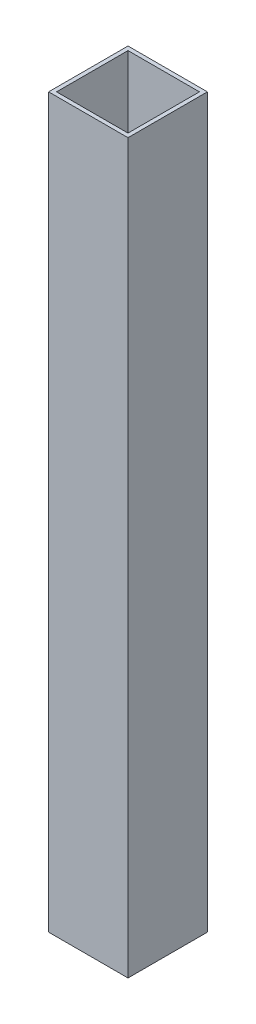
ISO-10303-21;
HEADER;
FILE_DESCRIPTION(('STEP AP214'),'2;1');
FILE_NAME('part.step','',(''),(''),'','','');
FILE_SCHEMA(('AUTOMOTIVE_DESIGN { 1 0 10303 214 1 1 1 1 }'));
ENDSEC;
DATA;
#1=APPLICATION_CONTEXT('core data for automotive mechanical design processes');
#2=APPLICATION_PROTOCOL_DEFINITION('international standard','automotive_design',2000,#1);
#3=PRODUCT_CONTEXT('',#1,'mechanical');
#4=PRODUCT('Part','Part','',(#3));
#5=PRODUCT_RELATED_PRODUCT_CATEGORY('part','',(#4));
#6=PRODUCT_DEFINITION_FORMATION('','',#4);
#7=PRODUCT_DEFINITION_CONTEXT('part definition',#1,'design');
#8=PRODUCT_DEFINITION('design','',#6,#7);
#9=PRODUCT_DEFINITION_SHAPE('','',#8);
#10=(LENGTH_UNIT() NAMED_UNIT(*) SI_UNIT(.MILLI.,.METRE.));
#11=(NAMED_UNIT(*) PLANE_ANGLE_UNIT() SI_UNIT($,.RADIAN.));
#12=(NAMED_UNIT(*) SI_UNIT($,.STERADIAN.) SOLID_ANGLE_UNIT());
#13=UNCERTAINTY_MEASURE_WITH_UNIT(LENGTH_MEASURE(1.E-05),#10,'distance_accuracy_value','');
#14=(GEOMETRIC_REPRESENTATION_CONTEXT(3) GLOBAL_UNCERTAINTY_ASSIGNED_CONTEXT((#13)) GLOBAL_UNIT_ASSIGNED_CONTEXT((#10,
#11,#12)) REPRESENTATION_CONTEXT('',''));
#15=CARTESIAN_POINT('',(0.,0.,0.));
#16=DIRECTION('',(0.,0.,1.));
#17=DIRECTION('',(1.,0.,0.));
#18=AXIS2_PLACEMENT_3D('',#15,#16,#17);
#19=CARTESIAN_POINT('',(0.,275.,0.));
#20=DIRECTION('',(0.,1.,0.));
#21=DIRECTION('',(0.,0.,1.));
#22=AXIS2_PLACEMENT_3D('',#19,#20,#21);
#23=PLANE('',#22);
#24=DIRECTION('',(0.,0.,1.));
#25=VECTOR('',#24,1.);
#26=CARTESIAN_POINT('',(0.,275.,0.));
#27=LINE('',#26,#25);
#28=CARTESIAN_POINT('',(0.,275.,0.));
#29=VERTEX_POINT('',#28);
#30=CARTESIAN_POINT('',(0.,275.,30.));
#31=VERTEX_POINT('',#30);
#32=EDGE_CURVE('E142',#29,#31,#27,.T.);
#33=ORIENTED_EDGE('',*,*,#32,.T.);
#34=DIRECTION('',(1.,0.,0.));
#35=VECTOR('',#34,1.);
#36=CARTESIAN_POINT('',(0.,275.,30.));
#37=LINE('',#36,#35);
#38=CARTESIAN_POINT('',(30.,275.,30.));
#39=VERTEX_POINT('',#38);
#40=EDGE_CURVE('E145',#31,#39,#37,.T.);
#41=ORIENTED_EDGE('',*,*,#40,.T.);
#42=DIRECTION('',(0.,0.,-1.));
#43=VECTOR('',#42,1.);
#44=CARTESIAN_POINT('',(30.,275.,0.));
#45=LINE('',#44,#43);
#46=CARTESIAN_POINT('',(30.,275.,0.));
#47=VERTEX_POINT('',#46);
#48=EDGE_CURVE('E148',#39,#47,#45,.T.);
#49=ORIENTED_EDGE('',*,*,#48,.T.);
#50=DIRECTION('',(-1.,0.,0.));
#51=VECTOR('',#50,1.);
#52=CARTESIAN_POINT('',(0.,275.,0.));
#53=LINE('',#52,#51);
#54=EDGE_CURVE('E150',#47,#29,#53,.T.);
#55=ORIENTED_EDGE('',*,*,#54,.T.);
#56=EDGE_LOOP('',(#33,#41,#49,#55));
#57=FACE_BOUND('',#56,.T.);
#58=DIRECTION('',(1.,0.,0.));
#59=VECTOR('',#58,1.);
#60=CARTESIAN_POINT('',(1.5,275.,28.5));
#61=LINE('',#60,#59);
#62=CARTESIAN_POINT('',(1.5,275.,28.5));
#63=VERTEX_POINT('',#62);
#64=CARTESIAN_POINT('',(28.5,275.,28.5));
#65=VERTEX_POINT('',#64);
#66=EDGE_CURVE('E114',#63,#65,#61,.T.);
#67=ORIENTED_EDGE('',*,*,#66,.F.);
#68=DIRECTION('',(0.,0.,1.));
#69=VECTOR('',#68,1.);
#70=CARTESIAN_POINT('',(1.5,275.,1.5));
#71=LINE('',#70,#69);
#72=CARTESIAN_POINT('',(1.5,275.,1.5));
#73=VERTEX_POINT('',#72);
#74=EDGE_CURVE('E106',#73,#63,#71,.T.);
#75=ORIENTED_EDGE('',*,*,#74,.F.);
#76=DIRECTION('',(-1.,0.,0.));
#77=VECTOR('',#76,1.);
#78=CARTESIAN_POINT('',(1.5,275.,1.5));
#79=LINE('',#78,#77);
#80=CARTESIAN_POINT('',(28.5,275.,1.5));
#81=VERTEX_POINT('',#80);
#82=EDGE_CURVE('E128',#81,#73,#79,.T.);
#83=ORIENTED_EDGE('',*,*,#82,.F.);
#84=DIRECTION('',(0.,0.,-1.));
#85=VECTOR('',#84,1.);
#86=CARTESIAN_POINT('',(28.5,275.,1.5));
#87=LINE('',#86,#85);
#88=EDGE_CURVE('E126',#65,#81,#87,.T.);
#89=ORIENTED_EDGE('',*,*,#88,.F.);
#90=EDGE_LOOP('',(#67,#75,#83,#89));
#91=FACE_BOUND('',#90,.T.);
#92=ADVANCED_FACE('F41',(#57,#91),#23,.T.);
#93=CARTESIAN_POINT('',(0.,0.,0.));
#94=DIRECTION('',(0.,1.,0.));
#95=DIRECTION('',(0.,0.,1.));
#96=AXIS2_PLACEMENT_3D('',#93,#94,#95);
#97=PLANE('',#96);
#98=DIRECTION('',(0.,0.,1.));
#99=VECTOR('',#98,1.);
#100=CARTESIAN_POINT('',(0.,0.,0.));
#101=LINE('',#100,#99);
#102=CARTESIAN_POINT('',(0.,0.,0.));
#103=VERTEX_POINT('',#102);
#104=CARTESIAN_POINT('',(0.,0.,30.));
#105=VERTEX_POINT('',#104);
#106=EDGE_CURVE('E122',#103,#105,#101,.T.);
#107=ORIENTED_EDGE('',*,*,#106,.F.);
#108=DIRECTION('',(-1.,0.,0.));
#109=VECTOR('',#108,1.);
#110=CARTESIAN_POINT('',(0.,0.,0.));
#111=LINE('',#110,#109);
#112=CARTESIAN_POINT('',(30.,0.,0.));
#113=VERTEX_POINT('',#112);
#114=EDGE_CURVE('E146',#113,#103,#111,.T.);
#115=ORIENTED_EDGE('',*,*,#114,.F.);
#116=DIRECTION('',(0.,0.,-1.));
#117=VECTOR('',#116,1.);
#118=CARTESIAN_POINT('',(30.,0.,0.));
#119=LINE('',#118,#117);
#120=CARTESIAN_POINT('',(30.,0.,30.));
#121=VERTEX_POINT('',#120);
#122=EDGE_CURVE('E157',#121,#113,#119,.T.);
#123=ORIENTED_EDGE('',*,*,#122,.F.);
#124=DIRECTION('',(1.,0.,0.));
#125=VECTOR('',#124,1.);
#126=CARTESIAN_POINT('',(0.,0.,30.));
#127=LINE('',#126,#125);
#128=EDGE_CURVE('E155',#105,#121,#127,.T.);
#129=ORIENTED_EDGE('',*,*,#128,.F.);
#130=EDGE_LOOP('',(#107,#115,#123,#129));
#131=FACE_BOUND('',#130,.T.);
#132=DIRECTION('',(0.,0.,1.));
#133=VECTOR('',#132,1.);
#134=CARTESIAN_POINT('',(1.5,0.,1.5));
#135=LINE('',#134,#133);
#136=CARTESIAN_POINT('',(1.5,0.,1.5));
#137=VERTEX_POINT('',#136);
#138=CARTESIAN_POINT('',(1.5,0.,28.5));
#139=VERTEX_POINT('',#138);
#140=EDGE_CURVE('E64',#137,#139,#135,.T.);
#141=ORIENTED_EDGE('',*,*,#140,.T.);
#142=DIRECTION('',(1.,0.,0.));
#143=VECTOR('',#142,1.);
#144=CARTESIAN_POINT('',(1.5,0.,28.5));
#145=LINE('',#144,#143);
#146=CARTESIAN_POINT('',(28.5,0.,28.5));
#147=VERTEX_POINT('',#146);
#148=EDGE_CURVE('E121',#139,#147,#145,.T.);
#149=ORIENTED_EDGE('',*,*,#148,.T.);
#150=DIRECTION('',(0.,0.,-1.));
#151=VECTOR('',#150,1.);
#152=CARTESIAN_POINT('',(28.5,0.,1.5));
#153=LINE('',#152,#151);
#154=CARTESIAN_POINT('',(28.5,0.,1.5));
#155=VERTEX_POINT('',#154);
#156=EDGE_CURVE('E134',#147,#155,#153,.T.);
#157=ORIENTED_EDGE('',*,*,#156,.T.);
#158=DIRECTION('',(-1.,0.,0.));
#159=VECTOR('',#158,1.);
#160=CARTESIAN_POINT('',(1.5,0.,1.5));
#161=LINE('',#160,#159);
#162=EDGE_CURVE('E115',#155,#137,#161,.T.);
#163=ORIENTED_EDGE('',*,*,#162,.T.);
#164=EDGE_LOOP('',(#141,#149,#157,#163));
#165=FACE_BOUND('',#164,.T.);
#166=ADVANCED_FACE('F175',(#131,#165),#97,.F.);
#167=CARTESIAN_POINT('',(0.,275.,0.));
#168=DIRECTION('',(1.,0.,0.));
#169=DIRECTION('',(0.,0.,-1.));
#170=AXIS2_PLACEMENT_3D('',#167,#168,#169);
#171=PLANE('',#170);
#172=ORIENTED_EDGE('',*,*,#106,.T.);
#173=DIRECTION('',(0.,-1.,0.));
#174=VECTOR('',#173,1.);
#175=CARTESIAN_POINT('',(0.,275.,30.));
#176=LINE('',#175,#174);
#177=EDGE_CURVE('E11',#31,#105,#176,.T.);
#178=ORIENTED_EDGE('',*,*,#177,.F.);
#179=ORIENTED_EDGE('',*,*,#32,.F.);
#180=DIRECTION('',(0.,-1.,0.));
#181=VECTOR('',#180,1.);
#182=CARTESIAN_POINT('',(0.,275.,0.));
#183=LINE('',#182,#181);
#184=EDGE_CURVE('E152',#29,#103,#183,.T.);
#185=ORIENTED_EDGE('',*,*,#184,.T.);
#186=EDGE_LOOP('',(#172,#178,#179,#185));
#187=FACE_BOUND('',#186,.T.);
#188=ADVANCED_FACE('F43',(#187),#171,.F.);
#189=CARTESIAN_POINT('',(0.,275.,30.));
#190=DIRECTION('',(0.,0.,-1.));
#191=DIRECTION('',(-1.,0.,0.));
#192=AXIS2_PLACEMENT_3D('',#189,#190,#191);
#193=PLANE('',#192);
#194=ORIENTED_EDGE('',*,*,#128,.T.);
#195=DIRECTION('',(0.,-1.,0.));
#196=VECTOR('',#195,1.);
#197=CARTESIAN_POINT('',(30.,275.,30.));
#198=LINE('',#197,#196);
#199=EDGE_CURVE('E49',#39,#121,#198,.T.);
#200=ORIENTED_EDGE('',*,*,#199,.F.);
#201=ORIENTED_EDGE('',*,*,#40,.F.);
#202=ORIENTED_EDGE('',*,*,#177,.T.);
#203=EDGE_LOOP('',(#194,#200,#201,#202));
#204=FACE_BOUND('',#203,.T.);
#205=ADVANCED_FACE('F185',(#204),#193,.F.);
#206=CARTESIAN_POINT('',(30.,275.,0.));
#207=DIRECTION('',(-1.,0.,0.));
#208=DIRECTION('',(0.,0.,1.));
#209=AXIS2_PLACEMENT_3D('',#206,#207,#208);
#210=PLANE('',#209);
#211=ORIENTED_EDGE('',*,*,#122,.T.);
#212=DIRECTION('',(0.,-1.,0.));
#213=VECTOR('',#212,1.);
#214=CARTESIAN_POINT('',(30.,275.,0.));
#215=LINE('',#214,#213);
#216=EDGE_CURVE('E162',#47,#113,#215,.T.);
#217=ORIENTED_EDGE('',*,*,#216,.F.);
#218=ORIENTED_EDGE('',*,*,#48,.F.);
#219=ORIENTED_EDGE('',*,*,#199,.T.);
#220=EDGE_LOOP('',(#211,#217,#218,#219));
#221=FACE_BOUND('',#220,.T.);
#222=ADVANCED_FACE('F169',(#221),#210,.F.);
#223=CARTESIAN_POINT('',(0.,275.,0.));
#224=DIRECTION('',(0.,0.,1.));
#225=DIRECTION('',(1.,0.,0.));
#226=AXIS2_PLACEMENT_3D('',#223,#224,#225);
#227=PLANE('',#226);
#228=ORIENTED_EDGE('',*,*,#114,.T.);
#229=ORIENTED_EDGE('',*,*,#184,.F.);
#230=ORIENTED_EDGE('',*,*,#54,.F.);
#231=ORIENTED_EDGE('',*,*,#216,.T.);
#232=EDGE_LOOP('',(#228,#229,#230,#231));
#233=FACE_BOUND('',#232,.T.);
#234=ADVANCED_FACE('F179',(#233),#227,.F.);
#235=CARTESIAN_POINT('',(1.5,275.,1.5));
#236=DIRECTION('',(1.,0.,0.));
#237=DIRECTION('',(0.,0.,-1.));
#238=AXIS2_PLACEMENT_3D('',#235,#236,#237);
#239=PLANE('',#238);
#240=ORIENTED_EDGE('',*,*,#140,.F.);
#241=DIRECTION('',(0.,-1.,0.));
#242=VECTOR('',#241,1.);
#243=CARTESIAN_POINT('',(1.5,275.,1.5));
#244=LINE('',#243,#242);
#245=EDGE_CURVE('E110',#73,#137,#244,.T.);
#246=ORIENTED_EDGE('',*,*,#245,.F.);
#247=ORIENTED_EDGE('',*,*,#74,.T.);
#248=DIRECTION('',(0.,-1.,0.));
#249=VECTOR('',#248,1.);
#250=CARTESIAN_POINT('',(1.5,275.,28.5));
#251=LINE('',#250,#249);
#252=EDGE_CURVE('E109',#63,#139,#251,.T.);
#253=ORIENTED_EDGE('',*,*,#252,.T.);
#254=EDGE_LOOP('',(#240,#246,#247,#253));
#255=FACE_BOUND('',#254,.T.);
#256=ADVANCED_FACE('F108',(#255),#239,.T.);
#257=CARTESIAN_POINT('',(1.5,275.,28.5));
#258=DIRECTION('',(0.,0.,-1.));
#259=DIRECTION('',(-1.,0.,0.));
#260=AXIS2_PLACEMENT_3D('',#257,#258,#259);
#261=PLANE('',#260);
#262=ORIENTED_EDGE('',*,*,#148,.F.);
#263=ORIENTED_EDGE('',*,*,#252,.F.);
#264=ORIENTED_EDGE('',*,*,#66,.T.);
#265=DIRECTION('',(0.,-1.,0.));
#266=VECTOR('',#265,1.);
#267=CARTESIAN_POINT('',(28.5,275.,28.5));
#268=LINE('',#267,#266);
#269=EDGE_CURVE('E123',#65,#147,#268,.T.);
#270=ORIENTED_EDGE('',*,*,#269,.T.);
#271=EDGE_LOOP('',(#262,#263,#264,#270));
#272=FACE_BOUND('',#271,.T.);
#273=ADVANCED_FACE('F118',(#272),#261,.T.);
#274=CARTESIAN_POINT('',(28.5,275.,1.5));
#275=DIRECTION('',(-1.,0.,0.));
#276=DIRECTION('',(0.,0.,1.));
#277=AXIS2_PLACEMENT_3D('',#274,#275,#276);
#278=PLANE('',#277);
#279=ORIENTED_EDGE('',*,*,#156,.F.);
#280=ORIENTED_EDGE('',*,*,#269,.F.);
#281=ORIENTED_EDGE('',*,*,#88,.T.);
#282=DIRECTION('',(0.,-1.,0.));
#283=VECTOR('',#282,1.);
#284=CARTESIAN_POINT('',(28.5,275.,1.5));
#285=LINE('',#284,#283);
#286=EDGE_CURVE('E56',#81,#155,#285,.T.);
#287=ORIENTED_EDGE('',*,*,#286,.T.);
#288=EDGE_LOOP('',(#279,#280,#281,#287));
#289=FACE_BOUND('',#288,.T.);
#290=ADVANCED_FACE('F208',(#289),#278,.T.);
#291=CARTESIAN_POINT('',(1.5,275.,1.5));
#292=DIRECTION('',(0.,0.,1.));
#293=DIRECTION('',(1.,0.,0.));
#294=AXIS2_PLACEMENT_3D('',#291,#292,#293);
#295=PLANE('',#294);
#296=ORIENTED_EDGE('',*,*,#162,.F.);
#297=ORIENTED_EDGE('',*,*,#286,.F.);
#298=ORIENTED_EDGE('',*,*,#82,.T.);
#299=ORIENTED_EDGE('',*,*,#245,.T.);
#300=EDGE_LOOP('',(#296,#297,#298,#299));
#301=FACE_BOUND('',#300,.T.);
#302=ADVANCED_FACE('F212',(#301),#295,.T.);
#303=CLOSED_SHELL('',(#92,#166,#188,#205,#222,#234,#256,#273,#290,#302));
#304=MANIFOLD_SOLID_BREP('B2',#303);
#305=ADVANCED_BREP_SHAPE_REPRESENTATION('',(#18,#304),#14);
#306=SHAPE_DEFINITION_REPRESENTATION(#9,#305);
ENDSEC;
END-ISO-10303-21;
